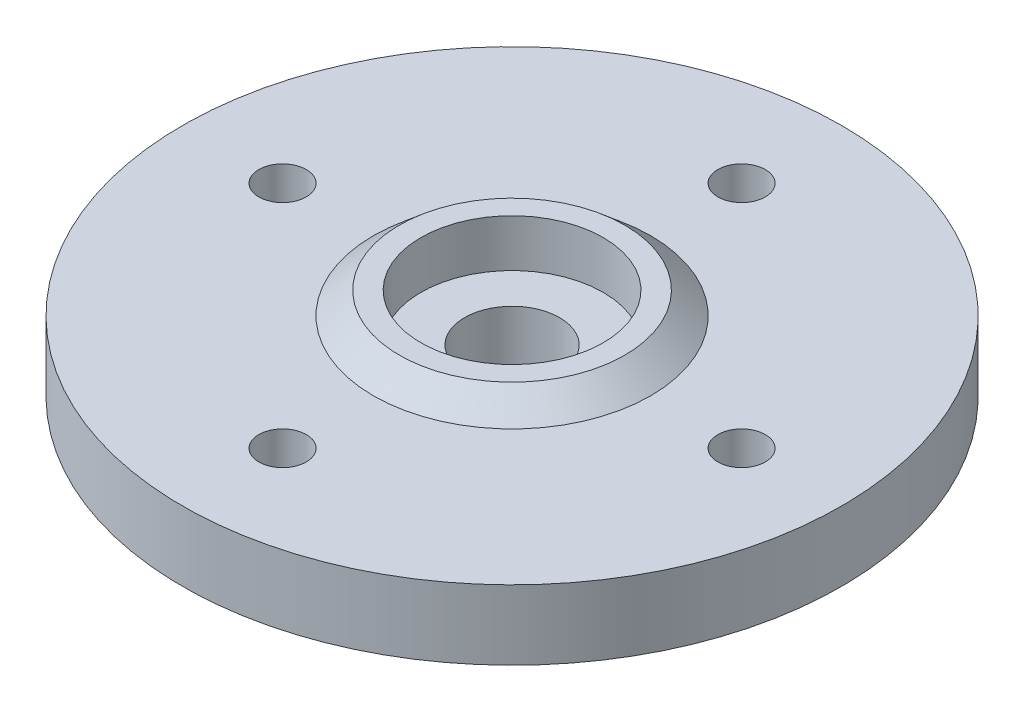
ISO-10303-21;
HEADER;
FILE_DESCRIPTION(('STEP AP214'),'2;1');
FILE_NAME('part.step','',(''),(''),'','','');
FILE_SCHEMA(('AUTOMOTIVE_DESIGN { 1 0 10303 214 1 1 1 1 }'));
ENDSEC;
DATA;
#1=APPLICATION_CONTEXT('core data for automotive mechanical design processes');
#2=APPLICATION_PROTOCOL_DEFINITION('international standard','automotive_design',2000,#1);
#3=PRODUCT_CONTEXT('',#1,'mechanical');
#4=PRODUCT('Part','Part','',(#3));
#5=PRODUCT_RELATED_PRODUCT_CATEGORY('part','',(#4));
#6=PRODUCT_DEFINITION_FORMATION('','',#4);
#7=PRODUCT_DEFINITION_CONTEXT('part definition',#1,'design');
#8=PRODUCT_DEFINITION('design','',#6,#7);
#9=PRODUCT_DEFINITION_SHAPE('','',#8);
#10=(LENGTH_UNIT() NAMED_UNIT(*) SI_UNIT(.MILLI.,.METRE.));
#11=(NAMED_UNIT(*) PLANE_ANGLE_UNIT() SI_UNIT($,.RADIAN.));
#12=(NAMED_UNIT(*) SI_UNIT($,.STERADIAN.) SOLID_ANGLE_UNIT());
#13=UNCERTAINTY_MEASURE_WITH_UNIT(LENGTH_MEASURE(1.E-05),#10,'distance_accuracy_value','');
#14=(GEOMETRIC_REPRESENTATION_CONTEXT(3) GLOBAL_UNCERTAINTY_ASSIGNED_CONTEXT((#13)) GLOBAL_UNIT_ASSIGNED_CONTEXT((#10,
#11,#12)) REPRESENTATION_CONTEXT('',''));
#15=CARTESIAN_POINT('',(0.,0.,0.));
#16=DIRECTION('',(0.,0.,1.));
#17=DIRECTION('',(1.,0.,0.));
#18=AXIS2_PLACEMENT_3D('',#15,#16,#17);
#19=CARTESIAN_POINT('',(-4.33,0.,0.));
#20=DIRECTION('',(0.,1.,0.));
#21=DIRECTION('',(0.,0.,1.));
#22=AXIS2_PLACEMENT_3D('',#19,#20,#21);
#23=PLANE('',#22);
#24=CARTESIAN_POINT('',(0.,0.,0.));
#25=DIRECTION('',(0.,-1.,0.));
#26=DIRECTION('',(0.,0.,-1.));
#27=AXIS2_PLACEMENT_3D('',#24,#25,#26);
#28=CIRCLE('',#27,2.88);
#29=CARTESIAN_POINT('',(0.,0.,-2.88));
#30=VERTEX_POINT('',#29);
#31=EDGE_CURVE('E10',#30,#30,#28,.T.);
#32=ORIENTED_EDGE('',*,*,#31,.F.);
#33=EDGE_LOOP('',(#32));
#34=FACE_BOUND('',#33,.T.);
#35=CARTESIAN_POINT('',(0.,0.,0.));
#36=DIRECTION('',(0.,-1.,0.));
#37=DIRECTION('',(0.,0.,-1.));
#38=AXIS2_PLACEMENT_3D('',#35,#36,#37);
#39=CIRCLE('',#38,4.33);
#40=CARTESIAN_POINT('',(0.,0.,-4.33));
#41=VERTEX_POINT('',#40);
#42=EDGE_CURVE('E63',#41,#41,#39,.T.);
#43=ORIENTED_EDGE('',*,*,#42,.T.);
#44=EDGE_LOOP('',(#43));
#45=FACE_BOUND('',#44,.T.);
#46=ADVANCED_FACE('F36',(#34,#45),#23,.F.);
#47=CARTESIAN_POINT('',(0.,0.,0.));
#48=DIRECTION('',(0.,-1.,0.));
#49=DIRECTION('',(0.,0.,-1.));
#50=AXIS2_PLACEMENT_3D('',#47,#48,#49);
#51=CYLINDRICAL_SURFACE('',#50,2.88);
#52=CARTESIAN_POINT('',(0.,2.9,0.));
#53=DIRECTION('',(0.,-1.,0.));
#54=DIRECTION('',(0.,0.,-1.));
#55=AXIS2_PLACEMENT_3D('',#52,#53,#54);
#56=CIRCLE('',#55,2.88);
#57=CARTESIAN_POINT('',(0.,2.9,-2.88));
#58=VERTEX_POINT('',#57);
#59=EDGE_CURVE('E43',#58,#58,#56,.T.);
#60=ORIENTED_EDGE('',*,*,#59,.F.);
#61=EDGE_LOOP('',(#60));
#62=FACE_BOUND('',#61,.T.);
#63=ORIENTED_EDGE('',*,*,#31,.T.);
#64=EDGE_LOOP('',(#63));
#65=FACE_BOUND('',#64,.T.);
#66=ADVANCED_FACE('F105',(#62,#65),#51,.F.);
#67=CARTESIAN_POINT('',(-2.88,2.9,0.));
#68=DIRECTION('',(0.,1.,0.));
#69=DIRECTION('',(0.,0.,1.));
#70=AXIS2_PLACEMENT_3D('',#67,#68,#69);
#71=PLANE('',#70);
#72=CARTESIAN_POINT('',(0.,2.9,0.));
#73=DIRECTION('',(0.,-1.,0.));
#74=DIRECTION('',(0.,0.,-1.));
#75=AXIS2_PLACEMENT_3D('',#72,#73,#74);
#76=CIRCLE('',#75,1.5);
#77=CARTESIAN_POINT('',(0.,2.9,-1.5));
#78=VERTEX_POINT('',#77);
#79=EDGE_CURVE('E48',#78,#78,#76,.T.);
#80=ORIENTED_EDGE('',*,*,#79,.F.);
#81=EDGE_LOOP('',(#80));
#82=FACE_BOUND('',#81,.T.);
#83=ORIENTED_EDGE('',*,*,#59,.T.);
#84=EDGE_LOOP('',(#83));
#85=FACE_BOUND('',#84,.T.);
#86=ADVANCED_FACE('F102',(#82,#85),#71,.F.);
#87=CARTESIAN_POINT('',(0.,0.,0.));
#88=DIRECTION('',(0.,-1.,0.));
#89=DIRECTION('',(0.,0.,-1.));
#90=AXIS2_PLACEMENT_3D('',#87,#88,#89);
#91=CYLINDRICAL_SURFACE('',#90,1.5);
#92=CARTESIAN_POINT('',(0.,4.6,0.));
#93=DIRECTION('',(0.,-1.,0.));
#94=DIRECTION('',(0.,0.,-1.));
#95=AXIS2_PLACEMENT_3D('',#92,#93,#94);
#96=CIRCLE('',#95,1.5);
#97=CARTESIAN_POINT('',(0.,4.6,-1.5));
#98=VERTEX_POINT('',#97);
#99=EDGE_CURVE('E95',#98,#98,#96,.T.);
#100=ORIENTED_EDGE('',*,*,#99,.F.);
#101=EDGE_LOOP('',(#100));
#102=FACE_BOUND('',#101,.T.);
#103=ORIENTED_EDGE('',*,*,#79,.T.);
#104=EDGE_LOOP('',(#103));
#105=FACE_BOUND('',#104,.T.);
#106=ADVANCED_FACE('F100',(#102,#105),#91,.F.);
#107=CARTESIAN_POINT('',(-1.5,4.6,0.));
#108=DIRECTION('',(0.,-1.,0.));
#109=DIRECTION('',(0.,0.,-1.));
#110=AXIS2_PLACEMENT_3D('',#107,#108,#109);
#111=PLANE('',#110);
#112=CARTESIAN_POINT('',(0.,4.6,0.));
#113=DIRECTION('',(0.,-1.,0.));
#114=DIRECTION('',(0.,0.,-1.));
#115=AXIS2_PLACEMENT_3D('',#112,#113,#114);
#116=CIRCLE('',#115,2.88);
#117=CARTESIAN_POINT('',(0.,4.6,-2.88));
#118=VERTEX_POINT('',#117);
#119=EDGE_CURVE('E92',#118,#118,#116,.T.);
#120=ORIENTED_EDGE('',*,*,#119,.F.);
#121=EDGE_LOOP('',(#120));
#122=FACE_BOUND('',#121,.T.);
#123=ORIENTED_EDGE('',*,*,#99,.T.);
#124=EDGE_LOOP('',(#123));
#125=FACE_BOUND('',#124,.T.);
#126=ADVANCED_FACE('F117',(#122,#125),#111,.F.);
#127=CARTESIAN_POINT('',(0.,0.,0.));
#128=DIRECTION('',(0.,-1.,0.));
#129=DIRECTION('',(0.,0.,-1.));
#130=AXIS2_PLACEMENT_3D('',#127,#128,#129);
#131=CYLINDRICAL_SURFACE('',#130,2.88);
#132=CARTESIAN_POINT('',(0.,6.1,0.));
#133=DIRECTION('',(0.,-1.,0.));
#134=DIRECTION('',(0.,0.,-1.));
#135=AXIS2_PLACEMENT_3D('',#132,#133,#134);
#136=CIRCLE('',#135,2.88);
#137=CARTESIAN_POINT('',(0.,6.1,-2.88));
#138=VERTEX_POINT('',#137);
#139=EDGE_CURVE('E89',#138,#138,#136,.T.);
#140=ORIENTED_EDGE('',*,*,#139,.F.);
#141=EDGE_LOOP('',(#140));
#142=FACE_BOUND('',#141,.T.);
#143=ORIENTED_EDGE('',*,*,#119,.T.);
#144=EDGE_LOOP('',(#143));
#145=FACE_BOUND('',#144,.T.);
#146=ADVANCED_FACE('F121',(#142,#145),#131,.F.);
#147=CARTESIAN_POINT('',(-2.88,6.1,0.));
#148=DIRECTION('',(0.,-1.,0.));
#149=DIRECTION('',(0.,0.,-1.));
#150=AXIS2_PLACEMENT_3D('',#147,#148,#149);
#151=PLANE('',#150);
#152=CARTESIAN_POINT('',(0.,6.1,0.));
#153=DIRECTION('',(0.,-1.,0.));
#154=DIRECTION('',(0.,0.,-1.));
#155=AXIS2_PLACEMENT_3D('',#152,#153,#154);
#156=CIRCLE('',#155,3.56);
#157=CARTESIAN_POINT('',(0.,6.1,-3.56));
#158=VERTEX_POINT('',#157);
#159=EDGE_CURVE('E86',#158,#158,#156,.T.);
#160=ORIENTED_EDGE('',*,*,#159,.F.);
#161=EDGE_LOOP('',(#160));
#162=FACE_BOUND('',#161,.T.);
#163=ORIENTED_EDGE('',*,*,#139,.T.);
#164=EDGE_LOOP('',(#163));
#165=FACE_BOUND('',#164,.T.);
#166=ADVANCED_FACE('F125',(#162,#165),#151,.F.);
#167=CARTESIAN_POINT('',(0.,6.1,0.));
#168=DIRECTION('',(0.,-1.,0.));
#169=DIRECTION('',(0.,0.,-1.));
#170=AXIS2_PLACEMENT_3D('',#167,#168,#169);
#171=CONICAL_SURFACE('',#170,3.56,0.864182124386593);
#172=CARTESIAN_POINT('',(0.,5.4,0.));
#173=DIRECTION('',(0.,-1.,0.));
#174=DIRECTION('',(0.,0.,-1.));
#175=AXIS2_PLACEMENT_3D('',#172,#173,#174);
#176=CIRCLE('',#175,4.38);
#177=CARTESIAN_POINT('',(0.,5.4,-4.38));
#178=VERTEX_POINT('',#177);
#179=EDGE_CURVE('E83',#178,#178,#176,.T.);
#180=ORIENTED_EDGE('',*,*,#179,.F.);
#181=EDGE_LOOP('',(#180));
#182=FACE_BOUND('',#181,.T.);
#183=ORIENTED_EDGE('',*,*,#159,.T.);
#184=EDGE_LOOP('',(#183));
#185=FACE_BOUND('',#184,.T.);
#186=ADVANCED_FACE('F129',(#182,#185),#171,.T.);
#187=CARTESIAN_POINT('',(-4.38,5.4,0.));
#188=DIRECTION('',(0.,-1.,0.));
#189=DIRECTION('',(0.,0.,-1.));
#190=AXIS2_PLACEMENT_3D('',#187,#188,#189);
#191=PLANE('',#190);
#192=CARTESIAN_POINT('',(0.,5.4,-7.25));
#193=DIRECTION('',(0.,1.,0.));
#194=DIRECTION('',(0.,0.,1.));
#195=AXIS2_PLACEMENT_3D('',#192,#193,#194);
#196=CIRCLE('',#195,0.75);
#197=CARTESIAN_POINT('',(0.,5.4,-6.5));
#198=VERTEX_POINT('',#197);
#199=EDGE_CURVE('E56',#198,#198,#196,.T.);
#200=ORIENTED_EDGE('',*,*,#199,.F.);
#201=EDGE_LOOP('',(#200));
#202=FACE_BOUND('',#201,.T.);
#203=CARTESIAN_POINT('',(7.25000000000082,5.4,-8.22897770087644E-13));
#204=DIRECTION('',(0.,1.,0.));
#205=DIRECTION('',(0.,0.,1.));
#206=AXIS2_PLACEMENT_3D('',#203,#204,#205);
#207=CIRCLE('',#206,0.750000000000571);
#208=CARTESIAN_POINT('',(7.25000000000082,5.4,0.749999999999748));
#209=VERTEX_POINT('',#208);
#210=EDGE_CURVE('E169',#209,#209,#207,.T.);
#211=ORIENTED_EDGE('',*,*,#210,.F.);
#212=EDGE_LOOP('',(#211));
#213=FACE_BOUND('',#212,.T.);
#214=CARTESIAN_POINT('',(1.64579554017529E-12,5.4,7.25));
#215=DIRECTION('',(0.,1.,0.));
#216=DIRECTION('',(0.,0.,1.));
#217=AXIS2_PLACEMENT_3D('',#214,#215,#216);
#218=CIRCLE('',#217,0.750000000001622);
#219=CARTESIAN_POINT('',(1.64579554017529E-12,5.4,8.00000000000162));
#220=VERTEX_POINT('',#219);
#221=EDGE_CURVE('E172',#220,#220,#218,.T.);
#222=ORIENTED_EDGE('',*,*,#221,.F.);
#223=EDGE_LOOP('',(#222));
#224=FACE_BOUND('',#223,.T.);
#225=CARTESIAN_POINT('',(-7.24999999999918,5.4,8.23785639017025E-13));
#226=DIRECTION('',(0.,1.,0.));
#227=DIRECTION('',(0.,0.,1.));
#228=AXIS2_PLACEMENT_3D('',#225,#226,#227);
#229=CIRCLE('',#228,0.750000000001101);
#230=CARTESIAN_POINT('',(-7.24999999999918,5.4,0.750000000001925));
#231=VERTEX_POINT('',#230);
#232=EDGE_CURVE('E75',#231,#231,#229,.T.);
#233=ORIENTED_EDGE('',*,*,#232,.F.);
#234=EDGE_LOOP('',(#233));
#235=FACE_BOUND('',#234,.T.);
#236=CARTESIAN_POINT('',(0.,5.4,0.));
#237=DIRECTION('',(0.,-1.,0.));
#238=DIRECTION('',(0.,0.,-1.));
#239=AXIS2_PLACEMENT_3D('',#236,#237,#238);
#240=CIRCLE('',#239,10.41);
#241=CARTESIAN_POINT('',(0.,5.4,-10.41));
#242=VERTEX_POINT('',#241);
#243=EDGE_CURVE('E80',#242,#242,#240,.T.);
#244=ORIENTED_EDGE('',*,*,#243,.F.);
#245=EDGE_LOOP('',(#244));
#246=FACE_BOUND('',#245,.T.);
#247=ORIENTED_EDGE('',*,*,#179,.T.);
#248=EDGE_LOOP('',(#247));
#249=FACE_BOUND('',#248,.T.);
#250=ADVANCED_FACE('F133',(#202,#213,#224,#235,#246,#249),#191,.F.);
#251=CARTESIAN_POINT('',(0.,0.,0.));
#252=DIRECTION('',(0.,-1.,0.));
#253=DIRECTION('',(0.,0.,-1.));
#254=AXIS2_PLACEMENT_3D('',#251,#252,#253);
#255=CYLINDRICAL_SURFACE('',#254,10.41);
#256=CARTESIAN_POINT('',(0.,3.2,0.));
#257=DIRECTION('',(0.,-1.,0.));
#258=DIRECTION('',(0.,0.,-1.));
#259=AXIS2_PLACEMENT_3D('',#256,#257,#258);
#260=CIRCLE('',#259,10.41);
#261=CARTESIAN_POINT('',(0.,3.2,-10.41));
#262=VERTEX_POINT('',#261);
#263=EDGE_CURVE('E72',#262,#262,#260,.T.);
#264=ORIENTED_EDGE('',*,*,#263,.F.);
#265=EDGE_LOOP('',(#264));
#266=FACE_BOUND('',#265,.T.);
#267=ORIENTED_EDGE('',*,*,#243,.T.);
#268=EDGE_LOOP('',(#267));
#269=FACE_BOUND('',#268,.T.);
#270=ADVANCED_FACE('F137',(#266,#269),#255,.T.);
#271=CARTESIAN_POINT('',(-10.41,3.2,0.));
#272=DIRECTION('',(0.,1.,0.));
#273=DIRECTION('',(0.,0.,1.));
#274=AXIS2_PLACEMENT_3D('',#271,#272,#273);
#275=PLANE('',#274);
#276=CARTESIAN_POINT('',(0.,3.2,-7.25));
#277=DIRECTION('',(0.,1.,0.));
#278=DIRECTION('',(0.,0.,1.));
#279=AXIS2_PLACEMENT_3D('',#276,#277,#278);
#280=CIRCLE('',#279,0.75);
#281=CARTESIAN_POINT('',(0.,3.2,-6.5));
#282=VERTEX_POINT('',#281);
#283=EDGE_CURVE('E39',#282,#282,#280,.T.);
#284=ORIENTED_EDGE('',*,*,#283,.T.);
#285=EDGE_LOOP('',(#284));
#286=FACE_BOUND('',#285,.T.);
#287=CARTESIAN_POINT('',(7.25000000000082,3.2,-8.22897770087644E-13));
#288=DIRECTION('',(0.,1.,0.));
#289=DIRECTION('',(0.,0.,1.));
#290=AXIS2_PLACEMENT_3D('',#287,#288,#289);
#291=CIRCLE('',#290,0.750000000000571);
#292=CARTESIAN_POINT('',(7.25000000000082,3.2,0.749999999999748));
#293=VERTEX_POINT('',#292);
#294=EDGE_CURVE('E58',#293,#293,#291,.T.);
#295=ORIENTED_EDGE('',*,*,#294,.T.);
#296=EDGE_LOOP('',(#295));
#297=FACE_BOUND('',#296,.T.);
#298=CARTESIAN_POINT('',(1.64579554017529E-12,3.2,7.25));
#299=DIRECTION('',(0.,1.,0.));
#300=DIRECTION('',(0.,0.,1.));
#301=AXIS2_PLACEMENT_3D('',#298,#299,#300);
#302=CIRCLE('',#301,0.750000000001622);
#303=CARTESIAN_POINT('',(1.64579554017529E-12,3.2,8.00000000000162));
#304=VERTEX_POINT('',#303);
#305=EDGE_CURVE('E55',#304,#304,#302,.T.);
#306=ORIENTED_EDGE('',*,*,#305,.T.);
#307=EDGE_LOOP('',(#306));
#308=FACE_BOUND('',#307,.T.);
#309=CARTESIAN_POINT('',(-7.24999999999918,3.2,8.23785639017025E-13));
#310=DIRECTION('',(0.,1.,0.));
#311=DIRECTION('',(0.,0.,1.));
#312=AXIS2_PLACEMENT_3D('',#309,#310,#311);
#313=CIRCLE('',#312,0.750000000001101);
#314=CARTESIAN_POINT('',(-7.24999999999918,3.2,0.750000000001925));
#315=VERTEX_POINT('',#314);
#316=EDGE_CURVE('E52',#315,#315,#313,.T.);
#317=ORIENTED_EDGE('',*,*,#316,.T.);
#318=EDGE_LOOP('',(#317));
#319=FACE_BOUND('',#318,.T.);
#320=CARTESIAN_POINT('',(0.,3.2,0.));
#321=DIRECTION('',(0.,-1.,0.));
#322=DIRECTION('',(0.,0.,-1.));
#323=AXIS2_PLACEMENT_3D('',#320,#321,#322);
#324=CIRCLE('',#323,4.33);
#325=CARTESIAN_POINT('',(0.,3.2,-4.33));
#326=VERTEX_POINT('',#325);
#327=EDGE_CURVE('E67',#326,#326,#324,.T.);
#328=ORIENTED_EDGE('',*,*,#327,.F.);
#329=EDGE_LOOP('',(#328));
#330=FACE_BOUND('',#329,.T.);
#331=ORIENTED_EDGE('',*,*,#263,.T.);
#332=EDGE_LOOP('',(#331));
#333=FACE_BOUND('',#332,.T.);
#334=ADVANCED_FACE('F141',(#286,#297,#308,#319,#330,#333),#275,.F.);
#335=CARTESIAN_POINT('',(0.,0.,0.));
#336=DIRECTION('',(0.,-1.,0.));
#337=DIRECTION('',(0.,0.,-1.));
#338=AXIS2_PLACEMENT_3D('',#335,#336,#337);
#339=CYLINDRICAL_SURFACE('',#338,4.33);
#340=ORIENTED_EDGE('',*,*,#42,.F.);
#341=EDGE_LOOP('',(#340));
#342=FACE_BOUND('',#341,.T.);
#343=ORIENTED_EDGE('',*,*,#327,.T.);
#344=EDGE_LOOP('',(#343));
#345=FACE_BOUND('',#344,.T.);
#346=ADVANCED_FACE('F145',(#342,#345),#339,.T.);
#347=CARTESIAN_POINT('',(-7.24999999999918,0.,8.23785639017025E-13));
#348=DIRECTION('',(0.,1.,0.));
#349=DIRECTION('',(0.,0.,1.));
#350=AXIS2_PLACEMENT_3D('',#347,#348,#349);
#351=CYLINDRICAL_SURFACE('',#350,0.750000000001101);
#352=CARTESIAN_POINT('',(-7.24999999999918,5.4,0.750000000001925));
#353=CARTESIAN_POINT('',(-7.24999999999918,5.37708333333333,0.750000000001925));
#354=CARTESIAN_POINT('',(-7.24999999999918,5.35416666666667,0.750000000001925));
#355=CARTESIAN_POINT('',(-7.24999999999918,5.30833333333333,0.750000000001925));
#356=CARTESIAN_POINT('',(-7.24999999999918,5.28541666666667,0.750000000001925));
#357=CARTESIAN_POINT('',(-7.24999999999918,5.23958333333333,0.750000000001925));
#358=CARTESIAN_POINT('',(-7.24999999999918,5.21666666666667,0.750000000001925));
#359=CARTESIAN_POINT('',(-7.24999999999918,5.17083333333333,0.750000000001925));
#360=CARTESIAN_POINT('',(-7.24999999999918,5.14791666666667,0.750000000001925));
#361=CARTESIAN_POINT('',(-7.24999999999918,5.10208333333333,0.750000000001925));
#362=CARTESIAN_POINT('',(-7.24999999999918,5.07916666666667,0.750000000001925));
#363=CARTESIAN_POINT('',(-7.24999999999918,5.03333333333333,0.750000000001925));
#364=CARTESIAN_POINT('',(-7.24999999999918,5.01041666666667,0.750000000001925));
#365=CARTESIAN_POINT('',(-7.24999999999918,4.96458333333333,0.750000000001925));
#366=CARTESIAN_POINT('',(-7.24999999999918,4.94166666666667,0.750000000001925));
#367=CARTESIAN_POINT('',(-7.24999999999918,4.89583333333333,0.750000000001925));
#368=CARTESIAN_POINT('',(-7.24999999999918,4.87291666666667,0.750000000001925));
#369=CARTESIAN_POINT('',(-7.24999999999918,4.82708333333333,0.750000000001925));
#370=CARTESIAN_POINT('',(-7.24999999999918,4.80416666666667,0.750000000001925));
#371=CARTESIAN_POINT('',(-7.24999999999918,4.75833333333333,0.750000000001925));
#372=CARTESIAN_POINT('',(-7.24999999999918,4.73541666666667,0.750000000001925));
#373=CARTESIAN_POINT('',(-7.24999999999918,4.68958333333333,0.750000000001925));
#374=CARTESIAN_POINT('',(-7.24999999999918,4.66666666666667,0.750000000001925));
#375=CARTESIAN_POINT('',(-7.24999999999918,4.62083333333333,0.750000000001925));
#376=CARTESIAN_POINT('',(-7.24999999999918,4.59791666666667,0.750000000001925));
#377=CARTESIAN_POINT('',(-7.24999999999918,4.55208333333333,0.750000000001925));
#378=CARTESIAN_POINT('',(-7.24999999999918,4.52916666666667,0.750000000001925));
#379=CARTESIAN_POINT('',(-7.24999999999918,4.48333333333333,0.750000000001925));
#380=CARTESIAN_POINT('',(-7.24999999999918,4.46041666666667,0.750000000001925));
#381=CARTESIAN_POINT('',(-7.24999999999918,4.41458333333333,0.750000000001925));
#382=CARTESIAN_POINT('',(-7.24999999999918,4.39166666666667,0.750000000001925));
#383=CARTESIAN_POINT('',(-7.24999999999918,4.34583333333333,0.750000000001925));
#384=CARTESIAN_POINT('',(-7.24999999999918,4.32291666666667,0.750000000001925));
#385=CARTESIAN_POINT('',(-7.24999999999918,4.27708333333333,0.750000000001925));
#386=CARTESIAN_POINT('',(-7.24999999999918,4.25416666666667,0.750000000001925));
#387=CARTESIAN_POINT('',(-7.24999999999918,4.20833333333333,0.750000000001925));
#388=CARTESIAN_POINT('',(-7.24999999999918,4.18541666666667,0.750000000001925));
#389=CARTESIAN_POINT('',(-7.24999999999918,4.13958333333333,0.750000000001925));
#390=CARTESIAN_POINT('',(-7.24999999999918,4.11666666666667,0.750000000001925));
#391=CARTESIAN_POINT('',(-7.24999999999918,4.07083333333333,0.750000000001925));
#392=CARTESIAN_POINT('',(-7.24999999999918,4.04791666666667,0.750000000001925));
#393=CARTESIAN_POINT('',(-7.24999999999918,4.00208333333333,0.750000000001925));
#394=CARTESIAN_POINT('',(-7.24999999999918,3.97916666666667,0.750000000001925));
#395=CARTESIAN_POINT('',(-7.24999999999918,3.93333333333333,0.750000000001925));
#396=CARTESIAN_POINT('',(-7.24999999999918,3.91041666666667,0.750000000001925));
#397=CARTESIAN_POINT('',(-7.24999999999918,3.86458333333333,0.750000000001925));
#398=CARTESIAN_POINT('',(-7.24999999999918,3.84166666666667,0.750000000001925));
#399=CARTESIAN_POINT('',(-7.24999999999918,3.79583333333333,0.750000000001925));
#400=CARTESIAN_POINT('',(-7.24999999999918,3.77291666666667,0.750000000001925));
#401=CARTESIAN_POINT('',(-7.24999999999918,3.72708333333333,0.750000000001925));
#402=CARTESIAN_POINT('',(-7.24999999999918,3.70416666666667,0.750000000001925));
#403=CARTESIAN_POINT('',(-7.24999999999918,3.65833333333333,0.750000000001925));
#404=CARTESIAN_POINT('',(-7.24999999999918,3.63541666666667,0.750000000001925));
#405=CARTESIAN_POINT('',(-7.24999999999918,3.58958333333333,0.750000000001925));
#406=CARTESIAN_POINT('',(-7.24999999999918,3.56666666666667,0.750000000001925));
#407=CARTESIAN_POINT('',(-7.24999999999918,3.52083333333333,0.750000000001925));
#408=CARTESIAN_POINT('',(-7.24999999999918,3.49791666666667,0.750000000001925));
#409=CARTESIAN_POINT('',(-7.24999999999918,3.45208333333333,0.750000000001925));
#410=CARTESIAN_POINT('',(-7.24999999999918,3.42916666666667,0.750000000001925));
#411=CARTESIAN_POINT('',(-7.24999999999918,3.38333333333333,0.750000000001925));
#412=CARTESIAN_POINT('',(-7.24999999999918,3.36041666666667,0.750000000001925));
#413=CARTESIAN_POINT('',(-7.24999999999918,3.31458333333333,0.750000000001925));
#414=CARTESIAN_POINT('',(-7.24999999999918,3.29166666666667,0.750000000001925));
#415=CARTESIAN_POINT('',(-7.24999999999918,3.24583333333333,0.750000000001925));
#416=CARTESIAN_POINT('',(-7.24999999999918,3.22291666666667,0.750000000001925));
#417=CARTESIAN_POINT('',(-7.24999999999918,3.2,0.750000000001925));
#418=B_SPLINE_CURVE_WITH_KNOTS('',3,(#352,#353,#354,#355,#356,#357,#358,#359,#360,#361,#362,
#363,#364,#365,#366,#367,#368,#369,#370,#371,#372,#373,#374,#375,#376,#377,#378,#379,#380,#381,
#382,#383,#384,#385,#386,#387,#388,#389,#390,#391,#392,#393,#394,#395,#396,#397,#398,#399,#400,
#401,#402,#403,#404,#405,#406,#407,#408,#409,#410,#411,#412,#413,#414,#415,#416,#417),
.UNSPECIFIED.,.F.,.F.,(4,2,2,2,2,2,2,2,2,2,2,2,2,2,2,2,2,2,2,2,2,2,2,2,2,2,2,2,2,2,2,2,4),(0.,
0.0687500000000002,0.1375,0.20625,0.275,0.34375,0.4125,0.48125,0.55,0.618749999999999,0.6875,
0.75625,0.825,0.89375,0.9625,1.03125,1.1,1.16875,1.2375,1.30625,1.375,1.44375,1.5125,1.58125,
1.65,1.71875,1.7875,1.85625,1.925,1.99375,2.0625,2.13125,2.2),.UNSPECIFIED.);
#419=EDGE_CURVE('BSEAM148',#231,#315,#418,.T.);
#420=ORIENTED_EDGE('',*,*,#232,.T.);
#421=ORIENTED_EDGE('',*,*,#316,.F.);
#422=ORIENTED_EDGE('',*,*,#419,.T.);
#423=ORIENTED_EDGE('',*,*,#419,.F.);
#424=EDGE_LOOP('',(#420,#422,#421,#423));
#425=FACE_BOUND('',#424,.T.);
#426=ADVANCED_FACE('F148',(#425),#351,.F.);
#427=CARTESIAN_POINT('',(1.64579554017529E-12,0.,7.25));
#428=DIRECTION('',(0.,1.,0.));
#429=DIRECTION('',(0.,0.,1.));
#430=AXIS2_PLACEMENT_3D('',#427,#428,#429);
#431=CYLINDRICAL_SURFACE('',#430,0.750000000001622);
#432=CARTESIAN_POINT('',(1.64579554017529E-12,5.4,8.00000000000162));
#433=CARTESIAN_POINT('',(1.64579554017529E-12,5.37708333333333,8.00000000000162));
#434=CARTESIAN_POINT('',(1.64579554017529E-12,5.35416666666667,8.00000000000162));
#435=CARTESIAN_POINT('',(1.64579554017529E-12,5.30833333333333,8.00000000000162));
#436=CARTESIAN_POINT('',(1.64579554017529E-12,5.28541666666667,8.00000000000162));
#437=CARTESIAN_POINT('',(1.64579554017529E-12,5.23958333333333,8.00000000000162));
#438=CARTESIAN_POINT('',(1.64579554017529E-12,5.21666666666667,8.00000000000162));
#439=CARTESIAN_POINT('',(1.64579554017529E-12,5.17083333333333,8.00000000000162));
#440=CARTESIAN_POINT('',(1.64579554017529E-12,5.14791666666667,8.00000000000162));
#441=CARTESIAN_POINT('',(1.64579554017529E-12,5.10208333333333,8.00000000000162));
#442=CARTESIAN_POINT('',(1.64579554017529E-12,5.07916666666667,8.00000000000162));
#443=CARTESIAN_POINT('',(1.64579554017529E-12,5.03333333333333,8.00000000000162));
#444=CARTESIAN_POINT('',(1.64579554017529E-12,5.01041666666667,8.00000000000162));
#445=CARTESIAN_POINT('',(1.64579554017529E-12,4.96458333333333,8.00000000000162));
#446=CARTESIAN_POINT('',(1.64579554017529E-12,4.94166666666667,8.00000000000162));
#447=CARTESIAN_POINT('',(1.64579554017529E-12,4.89583333333333,8.00000000000162));
#448=CARTESIAN_POINT('',(1.64579554017529E-12,4.87291666666667,8.00000000000162));
#449=CARTESIAN_POINT('',(1.64579554017529E-12,4.82708333333333,8.00000000000162));
#450=CARTESIAN_POINT('',(1.64579554017529E-12,4.80416666666667,8.00000000000162));
#451=CARTESIAN_POINT('',(1.64579554017529E-12,4.75833333333333,8.00000000000162));
#452=CARTESIAN_POINT('',(1.64579554017529E-12,4.73541666666667,8.00000000000162));
#453=CARTESIAN_POINT('',(1.64579554017529E-12,4.68958333333333,8.00000000000162));
#454=CARTESIAN_POINT('',(1.64579554017529E-12,4.66666666666667,8.00000000000162));
#455=CARTESIAN_POINT('',(1.64579554017529E-12,4.62083333333333,8.00000000000162));
#456=CARTESIAN_POINT('',(1.64579554017529E-12,4.59791666666667,8.00000000000162));
#457=CARTESIAN_POINT('',(1.64579554017529E-12,4.55208333333333,8.00000000000162));
#458=CARTESIAN_POINT('',(1.64579554017529E-12,4.52916666666667,8.00000000000162));
#459=CARTESIAN_POINT('',(1.64579554017529E-12,4.48333333333333,8.00000000000162));
#460=CARTESIAN_POINT('',(1.64579554017529E-12,4.46041666666667,8.00000000000162));
#461=CARTESIAN_POINT('',(1.64579554017529E-12,4.41458333333333,8.00000000000162));
#462=CARTESIAN_POINT('',(1.64579554017529E-12,4.39166666666667,8.00000000000162));
#463=CARTESIAN_POINT('',(1.64579554017529E-12,4.34583333333333,8.00000000000162));
#464=CARTESIAN_POINT('',(1.64579554017529E-12,4.32291666666667,8.00000000000162));
#465=CARTESIAN_POINT('',(1.64579554017529E-12,4.27708333333333,8.00000000000162));
#466=CARTESIAN_POINT('',(1.64579554017529E-12,4.25416666666667,8.00000000000162));
#467=CARTESIAN_POINT('',(1.64579554017529E-12,4.20833333333333,8.00000000000162));
#468=CARTESIAN_POINT('',(1.64579554017529E-12,4.18541666666667,8.00000000000162));
#469=CARTESIAN_POINT('',(1.64579554017529E-12,4.13958333333333,8.00000000000162));
#470=CARTESIAN_POINT('',(1.64579554017529E-12,4.11666666666667,8.00000000000162));
#471=CARTESIAN_POINT('',(1.64579554017529E-12,4.07083333333333,8.00000000000162));
#472=CARTESIAN_POINT('',(1.64579554017529E-12,4.04791666666667,8.00000000000162));
#473=CARTESIAN_POINT('',(1.64579554017529E-12,4.00208333333333,8.00000000000162));
#474=CARTESIAN_POINT('',(1.64579554017529E-12,3.97916666666667,8.00000000000162));
#475=CARTESIAN_POINT('',(1.64579554017529E-12,3.93333333333333,8.00000000000162));
#476=CARTESIAN_POINT('',(1.64579554017529E-12,3.91041666666667,8.00000000000162));
#477=CARTESIAN_POINT('',(1.64579554017529E-12,3.86458333333333,8.00000000000162));
#478=CARTESIAN_POINT('',(1.64579554017529E-12,3.84166666666667,8.00000000000162));
#479=CARTESIAN_POINT('',(1.64579554017529E-12,3.79583333333333,8.00000000000162));
#480=CARTESIAN_POINT('',(1.64579554017529E-12,3.77291666666667,8.00000000000162));
#481=CARTESIAN_POINT('',(1.64579554017529E-12,3.72708333333333,8.00000000000162));
#482=CARTESIAN_POINT('',(1.64579554017529E-12,3.70416666666667,8.00000000000162));
#483=CARTESIAN_POINT('',(1.64579554017529E-12,3.65833333333333,8.00000000000162));
#484=CARTESIAN_POINT('',(1.64579554017529E-12,3.63541666666667,8.00000000000162));
#485=CARTESIAN_POINT('',(1.64579554017529E-12,3.58958333333333,8.00000000000162));
#486=CARTESIAN_POINT('',(1.64579554017529E-12,3.56666666666667,8.00000000000162));
#487=CARTESIAN_POINT('',(1.64579554017529E-12,3.52083333333333,8.00000000000162));
#488=CARTESIAN_POINT('',(1.64579554017529E-12,3.49791666666667,8.00000000000162));
#489=CARTESIAN_POINT('',(1.64579554017529E-12,3.45208333333333,8.00000000000162));
#490=CARTESIAN_POINT('',(1.64579554017529E-12,3.42916666666667,8.00000000000162));
#491=CARTESIAN_POINT('',(1.64579554017529E-12,3.38333333333333,8.00000000000162));
#492=CARTESIAN_POINT('',(1.64579554017529E-12,3.36041666666667,8.00000000000162));
#493=CARTESIAN_POINT('',(1.64579554017529E-12,3.31458333333333,8.00000000000162));
#494=CARTESIAN_POINT('',(1.64579554017529E-12,3.29166666666667,8.00000000000162));
#495=CARTESIAN_POINT('',(1.64579554017529E-12,3.24583333333333,8.00000000000162));
#496=CARTESIAN_POINT('',(1.64579554017529E-12,3.22291666666667,8.00000000000162));
#497=CARTESIAN_POINT('',(1.64579554017529E-12,3.2,8.00000000000162));
#498=B_SPLINE_CURVE_WITH_KNOTS('',3,(#432,#433,#434,#435,#436,#437,#438,#439,#440,#441,#442,
#443,#444,#445,#446,#447,#448,#449,#450,#451,#452,#453,#454,#455,#456,#457,#458,#459,#460,#461,
#462,#463,#464,#465,#466,#467,#468,#469,#470,#471,#472,#473,#474,#475,#476,#477,#478,#479,#480,
#481,#482,#483,#484,#485,#486,#487,#488,#489,#490,#491,#492,#493,#494,#495,#496,#497),
.UNSPECIFIED.,.F.,.F.,(4,2,2,2,2,2,2,2,2,2,2,2,2,2,2,2,2,2,2,2,2,2,2,2,2,2,2,2,2,2,2,2,4),(0.,
0.0687500000000002,0.1375,0.20625,0.275,0.34375,0.4125,0.48125,0.55,0.618749999999999,0.6875,
0.75625,0.825,0.89375,0.9625,1.03125,1.1,1.16875,1.2375,1.30625,1.375,1.44375,1.5125,1.58125,
1.65,1.71875,1.7875,1.85625,1.925,1.99375,2.0625,2.13125,2.2),.UNSPECIFIED.);
#499=EDGE_CURVE('BSEAM152',#220,#304,#498,.T.);
#500=ORIENTED_EDGE('',*,*,#221,.T.);
#501=ORIENTED_EDGE('',*,*,#305,.F.);
#502=ORIENTED_EDGE('',*,*,#499,.T.);
#503=ORIENTED_EDGE('',*,*,#499,.F.);
#504=EDGE_LOOP('',(#500,#502,#501,#503));
#505=FACE_BOUND('',#504,.T.);
#506=ADVANCED_FACE('F152',(#505),#431,.F.);
#507=CARTESIAN_POINT('',(7.25000000000082,0.,-8.22897770087644E-13));
#508=DIRECTION('',(0.,1.,0.));
#509=DIRECTION('',(0.,0.,1.));
#510=AXIS2_PLACEMENT_3D('',#507,#508,#509);
#511=CYLINDRICAL_SURFACE('',#510,0.750000000000571);
#512=CARTESIAN_POINT('',(7.25000000000082,5.4,0.749999999999748));
#513=CARTESIAN_POINT('',(7.25000000000082,5.37708333333333,0.749999999999748));
#514=CARTESIAN_POINT('',(7.25000000000082,5.35416666666667,0.749999999999748));
#515=CARTESIAN_POINT('',(7.25000000000082,5.30833333333333,0.749999999999748));
#516=CARTESIAN_POINT('',(7.25000000000082,5.28541666666667,0.749999999999748));
#517=CARTESIAN_POINT('',(7.25000000000082,5.23958333333333,0.749999999999748));
#518=CARTESIAN_POINT('',(7.25000000000082,5.21666666666667,0.749999999999748));
#519=CARTESIAN_POINT('',(7.25000000000082,5.17083333333333,0.749999999999748));
#520=CARTESIAN_POINT('',(7.25000000000082,5.14791666666667,0.749999999999748));
#521=CARTESIAN_POINT('',(7.25000000000082,5.10208333333333,0.749999999999748));
#522=CARTESIAN_POINT('',(7.25000000000082,5.07916666666667,0.749999999999748));
#523=CARTESIAN_POINT('',(7.25000000000082,5.03333333333333,0.749999999999748));
#524=CARTESIAN_POINT('',(7.25000000000082,5.01041666666667,0.749999999999748));
#525=CARTESIAN_POINT('',(7.25000000000082,4.96458333333333,0.749999999999748));
#526=CARTESIAN_POINT('',(7.25000000000082,4.94166666666667,0.749999999999748));
#527=CARTESIAN_POINT('',(7.25000000000082,4.89583333333333,0.749999999999748));
#528=CARTESIAN_POINT('',(7.25000000000082,4.87291666666667,0.749999999999748));
#529=CARTESIAN_POINT('',(7.25000000000082,4.82708333333333,0.749999999999748));
#530=CARTESIAN_POINT('',(7.25000000000082,4.80416666666667,0.749999999999748));
#531=CARTESIAN_POINT('',(7.25000000000082,4.75833333333333,0.749999999999748));
#532=CARTESIAN_POINT('',(7.25000000000082,4.73541666666667,0.749999999999748));
#533=CARTESIAN_POINT('',(7.25000000000082,4.68958333333333,0.749999999999748));
#534=CARTESIAN_POINT('',(7.25000000000082,4.66666666666667,0.749999999999748));
#535=CARTESIAN_POINT('',(7.25000000000082,4.62083333333333,0.749999999999748));
#536=CARTESIAN_POINT('',(7.25000000000082,4.59791666666667,0.749999999999748));
#537=CARTESIAN_POINT('',(7.25000000000082,4.55208333333333,0.749999999999748));
#538=CARTESIAN_POINT('',(7.25000000000082,4.52916666666667,0.749999999999748));
#539=CARTESIAN_POINT('',(7.25000000000082,4.48333333333333,0.749999999999748));
#540=CARTESIAN_POINT('',(7.25000000000082,4.46041666666667,0.749999999999748));
#541=CARTESIAN_POINT('',(7.25000000000082,4.41458333333333,0.749999999999748));
#542=CARTESIAN_POINT('',(7.25000000000082,4.39166666666667,0.749999999999748));
#543=CARTESIAN_POINT('',(7.25000000000082,4.34583333333333,0.749999999999748));
#544=CARTESIAN_POINT('',(7.25000000000082,4.32291666666667,0.749999999999748));
#545=CARTESIAN_POINT('',(7.25000000000082,4.27708333333333,0.749999999999748));
#546=CARTESIAN_POINT('',(7.25000000000082,4.25416666666667,0.749999999999748));
#547=CARTESIAN_POINT('',(7.25000000000082,4.20833333333333,0.749999999999748));
#548=CARTESIAN_POINT('',(7.25000000000082,4.18541666666667,0.749999999999748));
#549=CARTESIAN_POINT('',(7.25000000000082,4.13958333333333,0.749999999999748));
#550=CARTESIAN_POINT('',(7.25000000000082,4.11666666666667,0.749999999999748));
#551=CARTESIAN_POINT('',(7.25000000000082,4.07083333333333,0.749999999999748));
#552=CARTESIAN_POINT('',(7.25000000000082,4.04791666666667,0.749999999999748));
#553=CARTESIAN_POINT('',(7.25000000000082,4.00208333333333,0.749999999999748));
#554=CARTESIAN_POINT('',(7.25000000000082,3.97916666666667,0.749999999999748));
#555=CARTESIAN_POINT('',(7.25000000000082,3.93333333333333,0.749999999999748));
#556=CARTESIAN_POINT('',(7.25000000000082,3.91041666666667,0.749999999999748));
#557=CARTESIAN_POINT('',(7.25000000000082,3.86458333333333,0.749999999999748));
#558=CARTESIAN_POINT('',(7.25000000000082,3.84166666666667,0.749999999999748));
#559=CARTESIAN_POINT('',(7.25000000000082,3.79583333333333,0.749999999999748));
#560=CARTESIAN_POINT('',(7.25000000000082,3.77291666666667,0.749999999999748));
#561=CARTESIAN_POINT('',(7.25000000000082,3.72708333333333,0.749999999999748));
#562=CARTESIAN_POINT('',(7.25000000000082,3.70416666666667,0.749999999999748));
#563=CARTESIAN_POINT('',(7.25000000000082,3.65833333333333,0.749999999999748));
#564=CARTESIAN_POINT('',(7.25000000000082,3.63541666666667,0.749999999999748));
#565=CARTESIAN_POINT('',(7.25000000000082,3.58958333333333,0.749999999999748));
#566=CARTESIAN_POINT('',(7.25000000000082,3.56666666666667,0.749999999999748));
#567=CARTESIAN_POINT('',(7.25000000000082,3.52083333333333,0.749999999999748));
#568=CARTESIAN_POINT('',(7.25000000000082,3.49791666666667,0.749999999999748));
#569=CARTESIAN_POINT('',(7.25000000000082,3.45208333333333,0.749999999999748));
#570=CARTESIAN_POINT('',(7.25000000000082,3.42916666666667,0.749999999999748));
#571=CARTESIAN_POINT('',(7.25000000000082,3.38333333333333,0.749999999999748));
#572=CARTESIAN_POINT('',(7.25000000000082,3.36041666666667,0.749999999999748));
#573=CARTESIAN_POINT('',(7.25000000000082,3.31458333333333,0.749999999999748));
#574=CARTESIAN_POINT('',(7.25000000000082,3.29166666666667,0.749999999999748));
#575=CARTESIAN_POINT('',(7.25000000000082,3.24583333333333,0.749999999999748));
#576=CARTESIAN_POINT('',(7.25000000000082,3.22291666666667,0.749999999999748));
#577=CARTESIAN_POINT('',(7.25000000000082,3.2,0.749999999999748));
#578=B_SPLINE_CURVE_WITH_KNOTS('',3,(#512,#513,#514,#515,#516,#517,#518,#519,#520,#521,#522,
#523,#524,#525,#526,#527,#528,#529,#530,#531,#532,#533,#534,#535,#536,#537,#538,#539,#540,#541,
#542,#543,#544,#545,#546,#547,#548,#549,#550,#551,#552,#553,#554,#555,#556,#557,#558,#559,#560,
#561,#562,#563,#564,#565,#566,#567,#568,#569,#570,#571,#572,#573,#574,#575,#576,#577),
.UNSPECIFIED.,.F.,.F.,(4,2,2,2,2,2,2,2,2,2,2,2,2,2,2,2,2,2,2,2,2,2,2,2,2,2,2,2,2,2,2,2,4),(0.,
0.0687500000000002,0.1375,0.20625,0.275,0.34375,0.4125,0.48125,0.55,0.618749999999999,0.6875,
0.75625,0.825,0.89375,0.9625,1.03125,1.1,1.16875,1.2375,1.30625,1.375,1.44375,1.5125,1.58125,
1.65,1.71875,1.7875,1.85625,1.925,1.99375,2.0625,2.13125,2.2),.UNSPECIFIED.);
#579=EDGE_CURVE('BSEAM156',#209,#293,#578,.T.);
#580=ORIENTED_EDGE('',*,*,#210,.T.);
#581=ORIENTED_EDGE('',*,*,#294,.F.);
#582=ORIENTED_EDGE('',*,*,#579,.T.);
#583=ORIENTED_EDGE('',*,*,#579,.F.);
#584=EDGE_LOOP('',(#580,#582,#581,#583));
#585=FACE_BOUND('',#584,.T.);
#586=ADVANCED_FACE('F156',(#585),#511,.F.);
#587=CARTESIAN_POINT('',(0.,0.,-7.25));
#588=DIRECTION('',(0.,1.,0.));
#589=DIRECTION('',(0.,0.,1.));
#590=AXIS2_PLACEMENT_3D('',#587,#588,#589);
#591=CYLINDRICAL_SURFACE('',#590,0.75);
#592=CARTESIAN_POINT('',(0.,5.4,-6.5));
#593=CARTESIAN_POINT('',(0.,5.37708333333333,-6.5));
#594=CARTESIAN_POINT('',(0.,5.35416666666667,-6.5));
#595=CARTESIAN_POINT('',(0.,5.30833333333333,-6.5));
#596=CARTESIAN_POINT('',(0.,5.28541666666667,-6.5));
#597=CARTESIAN_POINT('',(0.,5.23958333333333,-6.5));
#598=CARTESIAN_POINT('',(0.,5.21666666666667,-6.5));
#599=CARTESIAN_POINT('',(0.,5.17083333333333,-6.5));
#600=CARTESIAN_POINT('',(0.,5.14791666666667,-6.5));
#601=CARTESIAN_POINT('',(0.,5.10208333333333,-6.5));
#602=CARTESIAN_POINT('',(0.,5.07916666666667,-6.5));
#603=CARTESIAN_POINT('',(0.,5.03333333333333,-6.5));
#604=CARTESIAN_POINT('',(0.,5.01041666666667,-6.5));
#605=CARTESIAN_POINT('',(0.,4.96458333333333,-6.5));
#606=CARTESIAN_POINT('',(0.,4.94166666666667,-6.5));
#607=CARTESIAN_POINT('',(0.,4.89583333333333,-6.5));
#608=CARTESIAN_POINT('',(0.,4.87291666666667,-6.5));
#609=CARTESIAN_POINT('',(0.,4.82708333333333,-6.5));
#610=CARTESIAN_POINT('',(0.,4.80416666666667,-6.5));
#611=CARTESIAN_POINT('',(0.,4.75833333333333,-6.5));
#612=CARTESIAN_POINT('',(0.,4.73541666666667,-6.5));
#613=CARTESIAN_POINT('',(0.,4.68958333333333,-6.5));
#614=CARTESIAN_POINT('',(0.,4.66666666666667,-6.5));
#615=CARTESIAN_POINT('',(0.,4.62083333333333,-6.5));
#616=CARTESIAN_POINT('',(0.,4.59791666666667,-6.5));
#617=CARTESIAN_POINT('',(0.,4.55208333333333,-6.5));
#618=CARTESIAN_POINT('',(0.,4.52916666666667,-6.5));
#619=CARTESIAN_POINT('',(0.,4.48333333333333,-6.5));
#620=CARTESIAN_POINT('',(0.,4.46041666666667,-6.5));
#621=CARTESIAN_POINT('',(0.,4.41458333333333,-6.5));
#622=CARTESIAN_POINT('',(0.,4.39166666666667,-6.5));
#623=CARTESIAN_POINT('',(0.,4.34583333333333,-6.5));
#624=CARTESIAN_POINT('',(0.,4.32291666666667,-6.5));
#625=CARTESIAN_POINT('',(0.,4.27708333333333,-6.5));
#626=CARTESIAN_POINT('',(0.,4.25416666666667,-6.5));
#627=CARTESIAN_POINT('',(0.,4.20833333333333,-6.5));
#628=CARTESIAN_POINT('',(0.,4.18541666666667,-6.5));
#629=CARTESIAN_POINT('',(0.,4.13958333333333,-6.5));
#630=CARTESIAN_POINT('',(0.,4.11666666666667,-6.5));
#631=CARTESIAN_POINT('',(0.,4.07083333333333,-6.5));
#632=CARTESIAN_POINT('',(0.,4.04791666666667,-6.5));
#633=CARTESIAN_POINT('',(0.,4.00208333333333,-6.5));
#634=CARTESIAN_POINT('',(0.,3.97916666666667,-6.5));
#635=CARTESIAN_POINT('',(0.,3.93333333333333,-6.5));
#636=CARTESIAN_POINT('',(0.,3.91041666666667,-6.5));
#637=CARTESIAN_POINT('',(0.,3.86458333333333,-6.5));
#638=CARTESIAN_POINT('',(0.,3.84166666666667,-6.5));
#639=CARTESIAN_POINT('',(0.,3.79583333333333,-6.5));
#640=CARTESIAN_POINT('',(0.,3.77291666666667,-6.5));
#641=CARTESIAN_POINT('',(0.,3.72708333333333,-6.5));
#642=CARTESIAN_POINT('',(0.,3.70416666666667,-6.5));
#643=CARTESIAN_POINT('',(0.,3.65833333333333,-6.5));
#644=CARTESIAN_POINT('',(0.,3.63541666666667,-6.5));
#645=CARTESIAN_POINT('',(0.,3.58958333333333,-6.5));
#646=CARTESIAN_POINT('',(0.,3.56666666666667,-6.5));
#647=CARTESIAN_POINT('',(0.,3.52083333333333,-6.5));
#648=CARTESIAN_POINT('',(0.,3.49791666666667,-6.5));
#649=CARTESIAN_POINT('',(0.,3.45208333333333,-6.5));
#650=CARTESIAN_POINT('',(0.,3.42916666666667,-6.5));
#651=CARTESIAN_POINT('',(0.,3.38333333333333,-6.5));
#652=CARTESIAN_POINT('',(0.,3.36041666666667,-6.5));
#653=CARTESIAN_POINT('',(0.,3.31458333333333,-6.5));
#654=CARTESIAN_POINT('',(0.,3.29166666666667,-6.5));
#655=CARTESIAN_POINT('',(0.,3.24583333333333,-6.5));
#656=CARTESIAN_POINT('',(0.,3.22291666666667,-6.5));
#657=CARTESIAN_POINT('',(0.,3.2,-6.5));
#658=B_SPLINE_CURVE_WITH_KNOTS('',3,(#592,#593,#594,#595,#596,#597,#598,#599,#600,#601,#602,
#603,#604,#605,#606,#607,#608,#609,#610,#611,#612,#613,#614,#615,#616,#617,#618,#619,#620,#621,
#622,#623,#624,#625,#626,#627,#628,#629,#630,#631,#632,#633,#634,#635,#636,#637,#638,#639,#640,
#641,#642,#643,#644,#645,#646,#647,#648,#649,#650,#651,#652,#653,#654,#655,#656,#657),
.UNSPECIFIED.,.F.,.F.,(4,2,2,2,2,2,2,2,2,2,2,2,2,2,2,2,2,2,2,2,2,2,2,2,2,2,2,2,2,2,2,2,4),(0.,
0.0687500000000002,0.1375,0.20625,0.275,0.34375,0.4125,0.48125,0.55,0.618749999999999,0.6875,
0.75625,0.825,0.89375,0.9625,1.03125,1.1,1.16875,1.2375,1.30625,1.375,1.44375,1.5125,1.58125,
1.65,1.71875,1.7875,1.85625,1.925,1.99375,2.0625,2.13125,2.2),.UNSPECIFIED.);
#659=EDGE_CURVE('BSEAM160',#198,#282,#658,.T.);
#660=ORIENTED_EDGE('',*,*,#199,.T.);
#661=ORIENTED_EDGE('',*,*,#283,.F.);
#662=ORIENTED_EDGE('',*,*,#659,.T.);
#663=ORIENTED_EDGE('',*,*,#659,.F.);
#664=EDGE_LOOP('',(#660,#662,#661,#663));
#665=FACE_BOUND('',#664,.T.);
#666=ADVANCED_FACE('F160',(#665),#591,.F.);
#667=CLOSED_SHELL('',(#46,#66,#86,#106,#126,#146,#166,#186,#250,#270,#334,#346,#426,#506,#586,#666));
#668=MANIFOLD_SOLID_BREP('B2',#667);
#669=ADVANCED_BREP_SHAPE_REPRESENTATION('',(#18,#668),#14);
#670=SHAPE_DEFINITION_REPRESENTATION(#9,#669);
ENDSEC;
END-ISO-10303-21;
